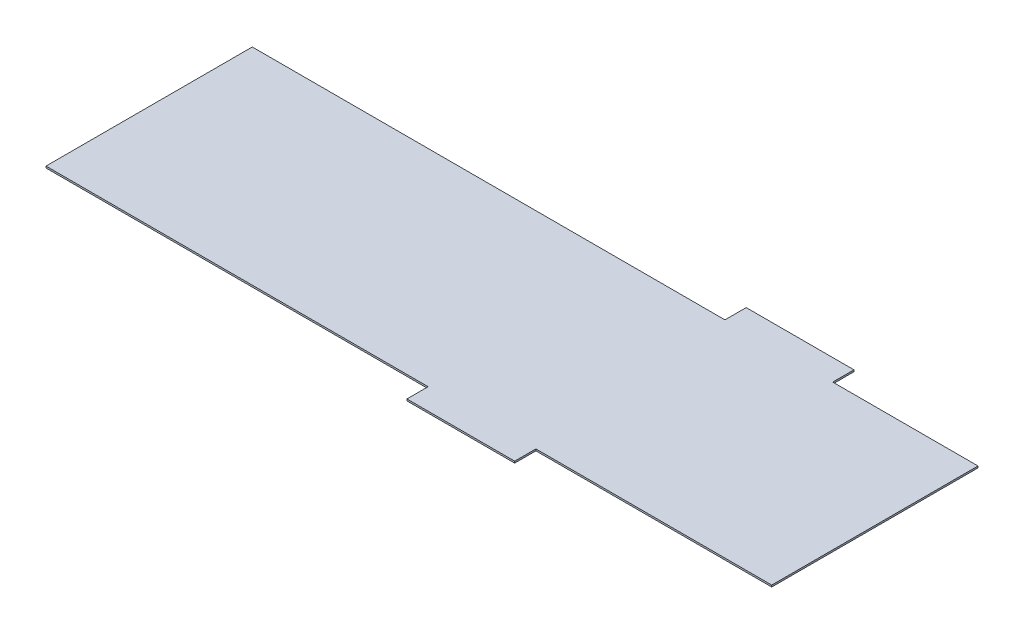
ISO-10303-21;
HEADER;
FILE_DESCRIPTION(('STEP AP214'),'2;1');
FILE_NAME('part.step','',(''),(''),'','','');
FILE_SCHEMA(('AUTOMOTIVE_DESIGN { 1 0 10303 214 1 1 1 1 }'));
ENDSEC;
DATA;
#1=APPLICATION_CONTEXT('core data for automotive mechanical design processes');
#2=APPLICATION_PROTOCOL_DEFINITION('international standard','automotive_design',2000,#1);
#3=PRODUCT_CONTEXT('',#1,'mechanical');
#4=PRODUCT('Part','Part','',(#3));
#5=PRODUCT_RELATED_PRODUCT_CATEGORY('part','',(#4));
#6=PRODUCT_DEFINITION_FORMATION('','',#4);
#7=PRODUCT_DEFINITION_CONTEXT('part definition',#1,'design');
#8=PRODUCT_DEFINITION('design','',#6,#7);
#9=PRODUCT_DEFINITION_SHAPE('','',#8);
#10=(LENGTH_UNIT() NAMED_UNIT(*) SI_UNIT(.MILLI.,.METRE.));
#11=(NAMED_UNIT(*) PLANE_ANGLE_UNIT() SI_UNIT($,.RADIAN.));
#12=(NAMED_UNIT(*) SI_UNIT($,.STERADIAN.) SOLID_ANGLE_UNIT());
#13=UNCERTAINTY_MEASURE_WITH_UNIT(LENGTH_MEASURE(1.E-05),#10,'distance_accuracy_value','');
#14=(GEOMETRIC_REPRESENTATION_CONTEXT(3) GLOBAL_UNCERTAINTY_ASSIGNED_CONTEXT((#13)) GLOBAL_UNIT_ASSIGNED_CONTEXT((#10,
#11,#12)) REPRESENTATION_CONTEXT('',''));
#15=CARTESIAN_POINT('',(0.,0.,0.));
#16=DIRECTION('',(0.,0.,1.));
#17=DIRECTION('',(1.,0.,0.));
#18=AXIS2_PLACEMENT_3D('',#15,#16,#17);
#19=CARTESIAN_POINT('',(-2540.42279663992,277.23522808979,2443.15492242865));
#20=DIRECTION('',(0.,0.,-1.));
#21=DIRECTION('',(0.,1.,0.));
#22=AXIS2_PLACEMENT_3D('',#19,#20,#21);
#23=PLANE('',#22);
#24=DIRECTION('',(-1.,0.,0.));
#25=VECTOR('',#24,1.);
#26=CARTESIAN_POINT('',(-2540.42279663992,287.23522808979,2443.15492242865));
#27=LINE('',#26,#25);
#28=CARTESIAN_POINT('',(1668.09720336008,287.235228089789,2443.15492242865));
#29=VERTEX_POINT('',#28);
#30=CARTESIAN_POINT('',(300.577203359979,287.23522808979,2443.15492242865));
#31=VERTEX_POINT('',#30);
#32=EDGE_CURVE('E188',#29,#31,#27,.T.);
#33=ORIENTED_EDGE('',*,*,#32,.T.);
#34=DIRECTION('',(0.,-1.,0.));
#35=VECTOR('',#34,1.);
#36=CARTESIAN_POINT('',(300.577203359979,277.23522808979,2443.15492242865));
#37=LINE('',#36,#35);
#38=CARTESIAN_POINT('',(300.577203359979,277.23522808979,2443.15492242865));
#39=VERTEX_POINT('',#38);
#40=EDGE_CURVE('E57',#31,#39,#37,.T.);
#41=ORIENTED_EDGE('',*,*,#40,.T.);
#42=DIRECTION('',(-1.,0.,0.));
#43=VECTOR('',#42,1.);
#44=CARTESIAN_POINT('',(-2540.42279663992,277.23522808979,2443.15492242865));
#45=LINE('',#44,#43);
#46=CARTESIAN_POINT('',(1668.09720336008,277.235228089789,2443.15492242865));
#47=VERTEX_POINT('',#46);
#48=EDGE_CURVE('E194',#47,#39,#45,.T.);
#49=ORIENTED_EDGE('',*,*,#48,.F.);
#50=DIRECTION('',(0.,1.,0.));
#51=VECTOR('',#50,1.);
#52=CARTESIAN_POINT('',(1668.09720336008,277.235228089789,2443.15492242865));
#53=LINE('',#52,#51);
#54=EDGE_CURVE('E208',#47,#29,#53,.T.);
#55=ORIENTED_EDGE('',*,*,#54,.T.);
#56=EDGE_LOOP('',(#33,#41,#49,#55));
#57=FACE_BOUND('',#56,.T.);
#58=ADVANCED_FACE('F34',(#57),#23,.F.);
#59=CARTESIAN_POINT('',(-2540.42279663992,277.235228089789,1246.9485923724));
#60=DIRECTION('',(0.,0.,1.));
#61=DIRECTION('',(0.,-1.,0.));
#62=AXIS2_PLACEMENT_3D('',#59,#60,#61);
#63=PLANE('',#62);
#64=DIRECTION('',(1.,0.,0.));
#65=VECTOR('',#64,1.);
#66=CARTESIAN_POINT('',(-2540.42279663992,277.235228089789,1246.9485923724));
#67=LINE('',#66,#65);
#68=CARTESIAN_POINT('',(825.528203359979,277.235228089789,1246.9485923724));
#69=VERTEX_POINT('',#68);
#70=CARTESIAN_POINT('',(1668.09720336008,277.235228089789,1246.9485923724));
#71=VERTEX_POINT('',#70);
#72=EDGE_CURVE('E187',#69,#71,#67,.T.);
#73=ORIENTED_EDGE('',*,*,#72,.F.);
#74=DIRECTION('',(0.,1.,0.));
#75=VECTOR('',#74,1.);
#76=CARTESIAN_POINT('',(825.528203359979,277.235228089789,1246.9485923724));
#77=LINE('',#76,#75);
#78=CARTESIAN_POINT('',(825.528203359979,287.235228089789,1246.9485923724));
#79=VERTEX_POINT('',#78);
#80=EDGE_CURVE('E180',#69,#79,#77,.T.);
#81=ORIENTED_EDGE('',*,*,#80,.T.);
#82=DIRECTION('',(1.,0.,0.));
#83=VECTOR('',#82,1.);
#84=CARTESIAN_POINT('',(-2540.42279663992,287.235228089789,1246.9485923724));
#85=LINE('',#84,#83);
#86=CARTESIAN_POINT('',(1668.09720336008,287.235228089789,1246.9485923724));
#87=VERTEX_POINT('',#86);
#88=EDGE_CURVE('E199',#79,#87,#85,.T.);
#89=ORIENTED_EDGE('',*,*,#88,.T.);
#90=DIRECTION('',(0.,1.,0.));
#91=VECTOR('',#90,1.);
#92=CARTESIAN_POINT('',(1668.09720336008,277.235228089789,1246.9485923724));
#93=LINE('',#92,#91);
#94=EDGE_CURVE('E42',#71,#87,#93,.T.);
#95=ORIENTED_EDGE('',*,*,#94,.F.);
#96=EDGE_LOOP('',(#73,#81,#89,#95));
#97=FACE_BOUND('',#96,.T.);
#98=ADVANCED_FACE('F238',(#97),#63,.F.);
#99=CARTESIAN_POINT('',(-2540.42279663992,277.23522808979,2443.15492242865));
#100=DIRECTION('',(1.,0.,0.));
#101=DIRECTION('',(0.,1.,0.));
#102=AXIS2_PLACEMENT_3D('',#99,#100,#101);
#103=PLANE('',#102);
#104=DIRECTION('',(0.,0.,-1.));
#105=VECTOR('',#104,1.);
#106=CARTESIAN_POINT('',(-2540.42279663992,287.23522808979,2443.15492242865));
#107=LINE('',#106,#105);
#108=CARTESIAN_POINT('',(-2540.42279663992,287.23522808979,2443.15492242865));
#109=VERTEX_POINT('',#108);
#110=CARTESIAN_POINT('',(-2540.42279663992,287.235228089789,1246.9485923724));
#111=VERTEX_POINT('',#110);
#112=EDGE_CURVE('E183',#109,#111,#107,.T.);
#113=ORIENTED_EDGE('',*,*,#112,.T.);
#114=DIRECTION('',(0.,1.,0.));
#115=VECTOR('',#114,1.);
#116=CARTESIAN_POINT('',(-2540.42279663992,277.235228089789,1246.9485923724));
#117=LINE('',#116,#115);
#118=CARTESIAN_POINT('',(-2540.42279663992,277.235228089789,1246.9485923724));
#119=VERTEX_POINT('',#118);
#120=EDGE_CURVE('E11',#119,#111,#117,.T.);
#121=ORIENTED_EDGE('',*,*,#120,.F.);
#122=DIRECTION('',(0.,0.,-1.));
#123=VECTOR('',#122,1.);
#124=CARTESIAN_POINT('',(-2540.42279663992,277.23522808979,2443.15492242865));
#125=LINE('',#124,#123);
#126=CARTESIAN_POINT('',(-2540.42279663992,277.23522808979,2443.15492242865));
#127=VERTEX_POINT('',#126);
#128=EDGE_CURVE('E184',#127,#119,#125,.T.);
#129=ORIENTED_EDGE('',*,*,#128,.F.);
#130=DIRECTION('',(0.,1.,0.));
#131=VECTOR('',#130,1.);
#132=CARTESIAN_POINT('',(-2540.42279663992,277.23522808979,2443.15492242865));
#133=LINE('',#132,#131);
#134=EDGE_CURVE('E196',#127,#109,#133,.T.);
#135=ORIENTED_EDGE('',*,*,#134,.T.);
#136=EDGE_LOOP('',(#113,#121,#129,#135));
#137=FACE_BOUND('',#136,.T.);
#138=ADVANCED_FACE('F36',(#137),#103,.F.);
#139=CARTESIAN_POINT('',(200.57720335998,287.235228089789,1246.9485923724));
#140=VERTEX_POINT('',#139);
#141=EDGE_CURVE('E200',#111,#140,#85,.T.);
#142=ORIENTED_EDGE('',*,*,#141,.T.);
#143=DIRECTION('',(0.,-1.,0.));
#144=VECTOR('',#143,1.);
#145=CARTESIAN_POINT('',(200.57720335998,277.235228089789,1246.9485923724));
#146=LINE('',#145,#144);
#147=CARTESIAN_POINT('',(200.57720335998,277.235228089789,1246.9485923724));
#148=VERTEX_POINT('',#147);
#149=EDGE_CURVE('E178',#140,#148,#146,.T.);
#150=ORIENTED_EDGE('',*,*,#149,.T.);
#151=EDGE_CURVE('E189',#119,#148,#67,.T.);
#152=ORIENTED_EDGE('',*,*,#151,.F.);
#153=ORIENTED_EDGE('',*,*,#120,.T.);
#154=EDGE_LOOP('',(#142,#150,#152,#153));
#155=FACE_BOUND('',#154,.T.);
#156=ADVANCED_FACE('F234',(#155),#63,.F.);
#157=CARTESIAN_POINT('',(1668.09720336008,277.235228089789,2443.15492242865));
#158=DIRECTION('',(-1.,0.,0.));
#159=DIRECTION('',(0.,0.,1.));
#160=AXIS2_PLACEMENT_3D('',#157,#158,#159);
#161=PLANE('',#160);
#162=DIRECTION('',(0.,0.,1.));
#163=VECTOR('',#162,1.);
#164=CARTESIAN_POINT('',(1668.09720336008,287.235228089789,2443.15492242865));
#165=LINE('',#164,#163);
#166=EDGE_CURVE('E202',#87,#29,#165,.T.);
#167=ORIENTED_EDGE('',*,*,#166,.T.);
#168=ORIENTED_EDGE('',*,*,#54,.F.);
#169=DIRECTION('',(0.,0.,1.));
#170=VECTOR('',#169,1.);
#171=CARTESIAN_POINT('',(1668.09720336008,277.235228089789,2443.15492242865));
#172=LINE('',#171,#170);
#173=EDGE_CURVE('E192',#71,#47,#172,.T.);
#174=ORIENTED_EDGE('',*,*,#173,.F.);
#175=ORIENTED_EDGE('',*,*,#94,.T.);
#176=EDGE_LOOP('',(#167,#168,#174,#175));
#177=FACE_BOUND('',#176,.T.);
#178=ADVANCED_FACE('F215',(#177),#161,.F.);
#179=CARTESIAN_POINT('',(-324.373796640021,277.23522808979,2443.15492242865));
#180=VERTEX_POINT('',#179);
#181=EDGE_CURVE('E49',#180,#127,#45,.T.);
#182=ORIENTED_EDGE('',*,*,#181,.F.);
#183=DIRECTION('',(0.,1.,0.));
#184=VECTOR('',#183,1.);
#185=CARTESIAN_POINT('',(-324.373796640021,277.23522808979,2443.15492242865));
#186=LINE('',#185,#184);
#187=CARTESIAN_POINT('',(-324.373796640021,287.23522808979,2443.15492242865));
#188=VERTEX_POINT('',#187);
#189=EDGE_CURVE('E141',#180,#188,#186,.T.);
#190=ORIENTED_EDGE('',*,*,#189,.T.);
#191=EDGE_CURVE('E204',#188,#109,#27,.T.);
#192=ORIENTED_EDGE('',*,*,#191,.T.);
#193=ORIENTED_EDGE('',*,*,#134,.F.);
#194=EDGE_LOOP('',(#182,#190,#192,#193));
#195=FACE_BOUND('',#194,.T.);
#196=ADVANCED_FACE('F226',(#195),#23,.F.);
#197=CARTESIAN_POINT('',(0.,277.235228089788,-1.80202894270855E-13));
#198=DIRECTION('',(0.,-1.,0.));
#199=DIRECTION('',(0.,0.,-1.));
#200=AXIS2_PLACEMENT_3D('',#197,#198,#199);
#201=PLANE('',#200);
#202=ORIENTED_EDGE('',*,*,#48,.T.);
#203=DIRECTION('',(0.,0.,1.));
#204=VECTOR('',#203,1.);
#205=CARTESIAN_POINT('',(300.577203359979,277.23522808979,2566.15492242862));
#206=LINE('',#205,#204);
#207=CARTESIAN_POINT('',(300.577203359979,277.23522808979,2566.15492242862));
#208=VERTEX_POINT('',#207);
#209=EDGE_CURVE('E136',#39,#208,#206,.T.);
#210=ORIENTED_EDGE('',*,*,#209,.T.);
#211=DIRECTION('',(-1.,0.,0.));
#212=VECTOR('',#211,1.);
#213=CARTESIAN_POINT('',(-324.373796640021,277.23522808979,2566.15492242862));
#214=LINE('',#213,#212);
#215=CARTESIAN_POINT('',(-324.373796640021,277.23522808979,2566.15492242862));
#216=VERTEX_POINT('',#215);
#217=EDGE_CURVE('E131',#208,#216,#214,.T.);
#218=ORIENTED_EDGE('',*,*,#217,.T.);
#219=DIRECTION('',(0.,0.,-1.));
#220=VECTOR('',#219,1.);
#221=CARTESIAN_POINT('',(-324.373796640021,277.23522808979,2566.15492242862));
#222=LINE('',#221,#220);
#223=EDGE_CURVE('E139',#216,#180,#222,.T.);
#224=ORIENTED_EDGE('',*,*,#223,.T.);
#225=ORIENTED_EDGE('',*,*,#181,.T.);
#226=ORIENTED_EDGE('',*,*,#128,.T.);
#227=ORIENTED_EDGE('',*,*,#151,.T.);
#228=DIRECTION('',(0.,0.,-1.));
#229=VECTOR('',#228,1.);
#230=CARTESIAN_POINT('',(200.577203359979,277.235228089789,1251.9485923724));
#231=LINE('',#230,#229);
#232=CARTESIAN_POINT('',(200.577203359979,277.235228089789,1123.74626231611));
#233=VERTEX_POINT('',#232);
#234=EDGE_CURVE('E158',#148,#233,#231,.T.);
#235=ORIENTED_EDGE('',*,*,#234,.T.);
#236=DIRECTION('',(1.,0.,0.));
#237=VECTOR('',#236,1.);
#238=CARTESIAN_POINT('',(200.577203359979,277.235228089789,1123.74626231611));
#239=LINE('',#238,#237);
#240=CARTESIAN_POINT('',(825.528203359979,277.235228089789,1123.74626231611));
#241=VERTEX_POINT('',#240);
#242=EDGE_CURVE('E166',#233,#241,#239,.T.);
#243=ORIENTED_EDGE('',*,*,#242,.T.);
#244=DIRECTION('',(0.,0.,1.));
#245=VECTOR('',#244,1.);
#246=CARTESIAN_POINT('',(825.528203359979,277.235228089789,1251.9485923724));
#247=LINE('',#246,#245);
#248=EDGE_CURVE('E169',#241,#69,#247,.T.);
#249=ORIENTED_EDGE('',*,*,#248,.T.);
#250=ORIENTED_EDGE('',*,*,#72,.T.);
#251=ORIENTED_EDGE('',*,*,#173,.T.);
#252=EDGE_LOOP('',(#202,#210,#218,#224,#225,#226,#227,#235,#243,#249,#250,#251));
#253=FACE_BOUND('',#252,.T.);
#254=ADVANCED_FACE('F144',(#253),#201,.T.);
#255=CARTESIAN_POINT('',(0.,287.235228089788,-1.86612132863084E-13));
#256=DIRECTION('',(0.,-1.,0.));
#257=DIRECTION('',(0.,0.,-1.));
#258=AXIS2_PLACEMENT_3D('',#255,#256,#257);
#259=PLANE('',#258);
#260=ORIENTED_EDGE('',*,*,#191,.F.);
#261=DIRECTION('',(0.,0.,1.));
#262=VECTOR('',#261,1.);
#263=CARTESIAN_POINT('',(-324.373796640021,287.23522808979,2566.15492242862));
#264=LINE('',#263,#262);
#265=CARTESIAN_POINT('',(-324.373796640021,287.23522808979,2566.15492242862));
#266=VERTEX_POINT('',#265);
#267=EDGE_CURVE('E154',#188,#266,#264,.T.);
#268=ORIENTED_EDGE('',*,*,#267,.T.);
#269=DIRECTION('',(1.,0.,0.));
#270=VECTOR('',#269,1.);
#271=CARTESIAN_POINT('',(-324.373796640021,287.23522808979,2566.15492242862));
#272=LINE('',#271,#270);
#273=CARTESIAN_POINT('',(300.577203359979,287.23522808979,2566.15492242862));
#274=VERTEX_POINT('',#273);
#275=EDGE_CURVE('E132',#266,#274,#272,.T.);
#276=ORIENTED_EDGE('',*,*,#275,.T.);
#277=DIRECTION('',(0.,0.,-1.));
#278=VECTOR('',#277,1.);
#279=CARTESIAN_POINT('',(300.577203359979,287.23522808979,2566.15492242862));
#280=LINE('',#279,#278);
#281=EDGE_CURVE('E152',#274,#31,#280,.T.);
#282=ORIENTED_EDGE('',*,*,#281,.T.);
#283=ORIENTED_EDGE('',*,*,#32,.F.);
#284=ORIENTED_EDGE('',*,*,#166,.F.);
#285=ORIENTED_EDGE('',*,*,#88,.F.);
#286=DIRECTION('',(0.,0.,-1.));
#287=VECTOR('',#286,1.);
#288=CARTESIAN_POINT('',(825.528203359979,287.235228089789,1251.9485923724));
#289=LINE('',#288,#287);
#290=CARTESIAN_POINT('',(825.52820335998,287.235228089789,1123.74626231611));
#291=VERTEX_POINT('',#290);
#292=EDGE_CURVE('E161',#79,#291,#289,.T.);
#293=ORIENTED_EDGE('',*,*,#292,.T.);
#294=DIRECTION('',(-1.,0.,0.));
#295=VECTOR('',#294,1.);
#296=CARTESIAN_POINT('',(200.577203359979,287.235228089789,1123.74626231611));
#297=LINE('',#296,#295);
#298=CARTESIAN_POINT('',(200.577203359979,287.235228089789,1123.74626231611));
#299=VERTEX_POINT('',#298);
#300=EDGE_CURVE('E159',#291,#299,#297,.T.);
#301=ORIENTED_EDGE('',*,*,#300,.T.);
#302=DIRECTION('',(0.,0.,1.));
#303=VECTOR('',#302,1.);
#304=CARTESIAN_POINT('',(200.577203359979,287.235228089789,1251.9485923724));
#305=LINE('',#304,#303);
#306=EDGE_CURVE('E164',#299,#140,#305,.T.);
#307=ORIENTED_EDGE('',*,*,#306,.T.);
#308=ORIENTED_EDGE('',*,*,#141,.F.);
#309=ORIENTED_EDGE('',*,*,#112,.F.);
#310=EDGE_LOOP('',(#260,#268,#276,#282,#283,#284,#285,#293,#301,#307,#308,#309));
#311=FACE_BOUND('',#310,.T.);
#312=ADVANCED_FACE('F220',(#311),#259,.F.);
#313=CARTESIAN_POINT('',(825.52820335998,925.200422934194,1251.9485923724));
#314=DIRECTION('',(1.,0.,0.));
#315=DIRECTION('',(0.,1.,0.));
#316=AXIS2_PLACEMENT_3D('',#313,#314,#315);
#317=PLANE('',#316);
#318=ORIENTED_EDGE('',*,*,#80,.F.);
#319=ORIENTED_EDGE('',*,*,#248,.F.);
#320=DIRECTION('',(0.,-1.,0.));
#321=VECTOR('',#320,1.);
#322=CARTESIAN_POINT('',(825.52820335998,925.200422934194,1123.74626231611));
#323=LINE('',#322,#321);
#324=EDGE_CURVE('E162',#291,#241,#323,.T.);
#325=ORIENTED_EDGE('',*,*,#324,.F.);
#326=ORIENTED_EDGE('',*,*,#292,.F.);
#327=EDGE_LOOP('',(#318,#319,#325,#326));
#328=FACE_BOUND('',#327,.T.);
#329=ADVANCED_FACE('F266',(#328),#317,.T.);
#330=CARTESIAN_POINT('',(200.57720335998,925.200422934194,1251.9485923724));
#331=DIRECTION('',(-1.,0.,0.));
#332=DIRECTION('',(0.,-1.,0.));
#333=AXIS2_PLACEMENT_3D('',#330,#331,#332);
#334=PLANE('',#333);
#335=ORIENTED_EDGE('',*,*,#149,.F.);
#336=ORIENTED_EDGE('',*,*,#306,.F.);
#337=DIRECTION('',(0.,-1.,0.));
#338=VECTOR('',#337,1.);
#339=CARTESIAN_POINT('',(200.57720335998,925.200422934194,1123.74626231611));
#340=LINE('',#339,#338);
#341=EDGE_CURVE('E172',#299,#233,#340,.T.);
#342=ORIENTED_EDGE('',*,*,#341,.T.);
#343=ORIENTED_EDGE('',*,*,#234,.F.);
#344=EDGE_LOOP('',(#335,#336,#342,#343));
#345=FACE_BOUND('',#344,.T.);
#346=ADVANCED_FACE('F255',(#345),#334,.T.);
#347=CARTESIAN_POINT('',(200.57720335998,925.200422934194,1123.74626231611));
#348=DIRECTION('',(0.,0.,-1.));
#349=DIRECTION('',(0.,1.,0.));
#350=AXIS2_PLACEMENT_3D('',#347,#348,#349);
#351=PLANE('',#350);
#352=ORIENTED_EDGE('',*,*,#300,.F.);
#353=ORIENTED_EDGE('',*,*,#324,.T.);
#354=ORIENTED_EDGE('',*,*,#242,.F.);
#355=ORIENTED_EDGE('',*,*,#341,.F.);
#356=EDGE_LOOP('',(#352,#353,#354,#355));
#357=FACE_BOUND('',#356,.T.);
#358=ADVANCED_FACE('F262',(#357),#351,.T.);
#359=CARTESIAN_POINT('',(300.577203359979,925.200422934195,2566.15492242862));
#360=DIRECTION('',(1.,0.,0.));
#361=DIRECTION('',(0.,1.,0.));
#362=AXIS2_PLACEMENT_3D('',#359,#360,#361);
#363=PLANE('',#362);
#364=ORIENTED_EDGE('',*,*,#40,.F.);
#365=ORIENTED_EDGE('',*,*,#281,.F.);
#366=DIRECTION('',(0.,-1.,0.));
#367=VECTOR('',#366,1.);
#368=CARTESIAN_POINT('',(300.577203359979,925.200422934195,2566.15492242862));
#369=LINE('',#368,#367);
#370=EDGE_CURVE('E135',#274,#208,#369,.T.);
#371=ORIENTED_EDGE('',*,*,#370,.T.);
#372=ORIENTED_EDGE('',*,*,#209,.F.);
#373=EDGE_LOOP('',(#364,#365,#371,#372));
#374=FACE_BOUND('',#373,.T.);
#375=ADVANCED_FACE('F224',(#374),#363,.T.);
#376=CARTESIAN_POINT('',(-324.373796640021,925.200422934195,2566.15492242862));
#377=DIRECTION('',(-1.,0.,0.));
#378=DIRECTION('',(0.,-1.,0.));
#379=AXIS2_PLACEMENT_3D('',#376,#377,#378);
#380=PLANE('',#379);
#381=ORIENTED_EDGE('',*,*,#189,.F.);
#382=ORIENTED_EDGE('',*,*,#223,.F.);
#383=DIRECTION('',(0.,-1.,0.));
#384=VECTOR('',#383,1.);
#385=CARTESIAN_POINT('',(-324.373796640021,925.200422934195,2566.15492242862));
#386=LINE('',#385,#384);
#387=EDGE_CURVE('E126',#266,#216,#386,.T.);
#388=ORIENTED_EDGE('',*,*,#387,.F.);
#389=ORIENTED_EDGE('',*,*,#267,.F.);
#390=EDGE_LOOP('',(#381,#382,#388,#389));
#391=FACE_BOUND('',#390,.T.);
#392=ADVANCED_FACE('F140',(#391),#380,.T.);
#393=CARTESIAN_POINT('',(-324.373796640021,925.200422934195,2566.15492242862));
#394=DIRECTION('',(0.,0.,1.));
#395=DIRECTION('',(0.,-1.,0.));
#396=AXIS2_PLACEMENT_3D('',#393,#394,#395);
#397=PLANE('',#396);
#398=ORIENTED_EDGE('',*,*,#275,.F.);
#399=ORIENTED_EDGE('',*,*,#387,.T.);
#400=ORIENTED_EDGE('',*,*,#217,.F.);
#401=ORIENTED_EDGE('',*,*,#370,.F.);
#402=EDGE_LOOP('',(#398,#399,#400,#401));
#403=FACE_BOUND('',#402,.T.);
#404=ADVANCED_FACE('F128',(#403),#397,.T.);
#405=CLOSED_SHELL('',(#58,#98,#138,#156,#178,#196,#254,#312,#329,#346,#358,#375,#392,#404));
#406=MANIFOLD_SOLID_BREP('B2',#405);
#407=ADVANCED_BREP_SHAPE_REPRESENTATION('',(#18,#406),#14);
#408=SHAPE_DEFINITION_REPRESENTATION(#9,#407);
ENDSEC;
END-ISO-10303-21;
